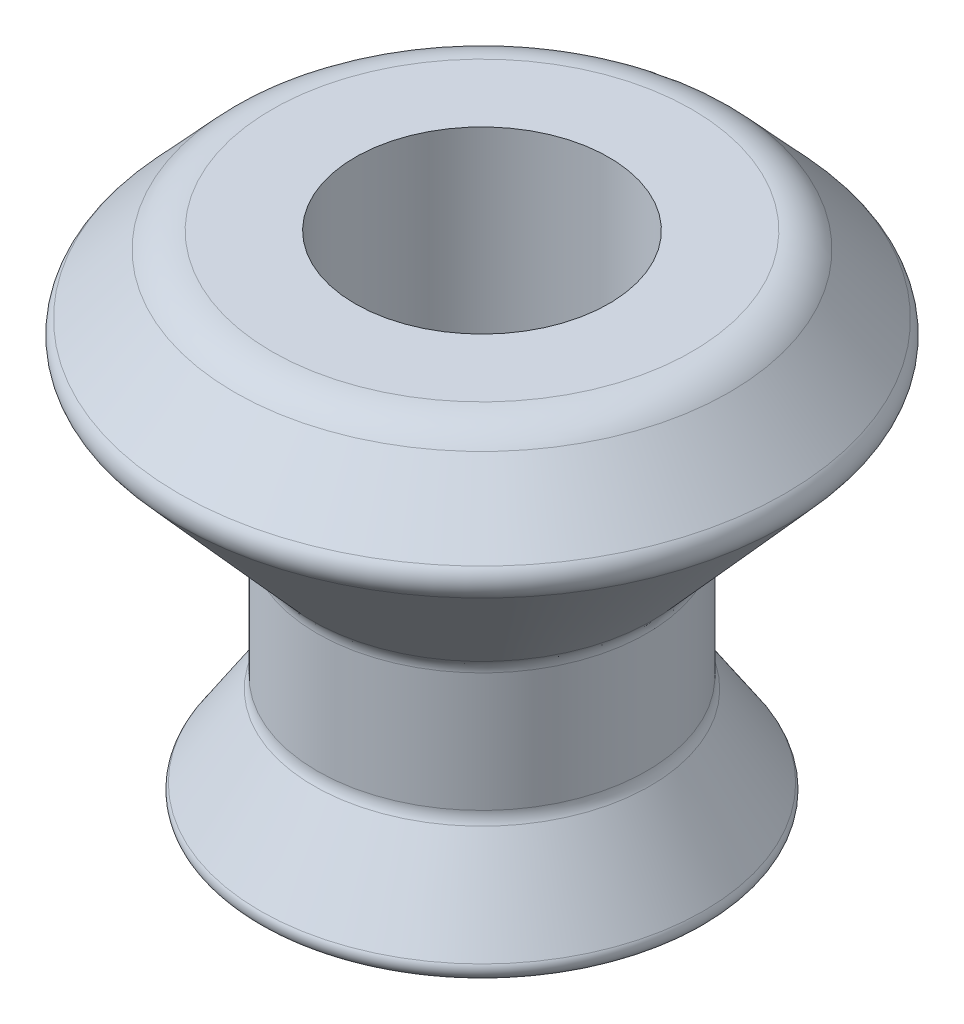
ISO-10303-21;
HEADER;
FILE_DESCRIPTION(('STEP AP214'),'2;1');
FILE_NAME('part.step','',(''),(''),'','','');
FILE_SCHEMA(('AUTOMOTIVE_DESIGN { 1 0 10303 214 1 1 1 1 }'));
ENDSEC;
DATA;
#1=APPLICATION_CONTEXT('core data for automotive mechanical design processes');
#2=APPLICATION_PROTOCOL_DEFINITION('international standard','automotive_design',2000,#1);
#3=PRODUCT_CONTEXT('',#1,'mechanical');
#4=PRODUCT('Part','Part','',(#3));
#5=PRODUCT_RELATED_PRODUCT_CATEGORY('part','',(#4));
#6=PRODUCT_DEFINITION_FORMATION('','',#4);
#7=PRODUCT_DEFINITION_CONTEXT('part definition',#1,'design');
#8=PRODUCT_DEFINITION('design','',#6,#7);
#9=PRODUCT_DEFINITION_SHAPE('','',#8);
#10=(LENGTH_UNIT() NAMED_UNIT(*) SI_UNIT(.MILLI.,.METRE.));
#11=(NAMED_UNIT(*) PLANE_ANGLE_UNIT() SI_UNIT($,.RADIAN.));
#12=(NAMED_UNIT(*) SI_UNIT($,.STERADIAN.) SOLID_ANGLE_UNIT());
#13=UNCERTAINTY_MEASURE_WITH_UNIT(LENGTH_MEASURE(1.E-05),#10,'distance_accuracy_value','');
#14=(GEOMETRIC_REPRESENTATION_CONTEXT(3) GLOBAL_UNCERTAINTY_ASSIGNED_CONTEXT((#13)) GLOBAL_UNIT_ASSIGNED_CONTEXT((#10,
#11,#12)) REPRESENTATION_CONTEXT('',''));
#15=CARTESIAN_POINT('',(0.,0.,0.));
#16=DIRECTION('',(0.,0.,1.));
#17=DIRECTION('',(1.,0.,0.));
#18=AXIS2_PLACEMENT_3D('',#15,#16,#17);
#19=CARTESIAN_POINT('',(0.,12.2682,0.));
#20=DIRECTION('',(0.,1.,0.));
#21=DIRECTION('',(0.,0.,1.));
#22=AXIS2_PLACEMENT_3D('',#19,#20,#21);
#23=PLANE('',#22);
#24=CARTESIAN_POINT('',(0.,12.2682,0.));
#25=DIRECTION('',(0.,1.,0.));
#26=DIRECTION('',(0.,0.,1.));
#27=AXIS2_PLACEMENT_3D('',#24,#25,#26);
#28=CIRCLE('',#27,3.1496);
#29=CARTESIAN_POINT('',(0.,12.2682,3.1496));
#30=VERTEX_POINT('',#29);
#31=EDGE_CURVE('E68',#30,#30,#28,.T.);
#32=ORIENTED_EDGE('',*,*,#31,.F.);
#33=EDGE_LOOP('',(#32));
#34=FACE_BOUND('',#33,.T.);
#35=CARTESIAN_POINT('',(0.,12.2682,0.));
#36=DIRECTION('',(0.,-1.,0.));
#37=DIRECTION('',(0.,0.,-1.));
#38=AXIS2_PLACEMENT_3D('',#35,#36,#37);
#39=CIRCLE('',#38,5.21100202038621);
#40=CARTESIAN_POINT('',(0.,12.2682,-5.21100202038621));
#41=VERTEX_POINT('',#40);
#42=EDGE_CURVE('E10',#41,#41,#39,.T.);
#43=ORIENTED_EDGE('',*,*,#42,.F.);
#44=EDGE_LOOP('',(#43));
#45=FACE_BOUND('',#44,.T.);
#46=ADVANCED_FACE('F30',(#34,#45),#23,.T.);
#47=CARTESIAN_POINT('',(0.,10.9982,0.));
#48=DIRECTION('',(0.,-1.,0.));
#49=DIRECTION('',(0.,0.,-1.));
#50=AXIS2_PLACEMENT_3D('',#47,#48,#49);
#51=TOROIDAL_SURFACE('',#50,5.21100202038622,1.27);
#52=ORIENTED_EDGE('',*,*,#42,.T.);
#53=EDGE_LOOP('',(#52));
#54=FACE_BOUND('',#53,.T.);
#55=CARTESIAN_POINT('',(0.,11.8611537655602,0.));
#56=DIRECTION('',(0.,-1.,0.));
#57=DIRECTION('',(0.,0.,-1.));
#58=AXIS2_PLACEMENT_3D('',#55,#56,#57);
#59=CIRCLE('',#58,6.14278031939598);
#60=CARTESIAN_POINT('',(0.,11.8611537655602,-6.14278031939598));
#61=VERTEX_POINT('',#60);
#62=EDGE_CURVE('E36',#61,#61,#59,.T.);
#63=ORIENTED_EDGE('',*,*,#62,.F.);
#64=EDGE_LOOP('',(#63));
#65=FACE_BOUND('',#64,.T.);
#66=ADVANCED_FACE('F95',(#54,#65),#51,.T.);
#67=CARTESIAN_POINT('',(0.,10.3721333400657,0.));
#68=DIRECTION('',(0.,-1.,0.));
#69=DIRECTION('',(0.,0.,-1.));
#70=AXIS2_PLACEMENT_3D('',#67,#68,#69);
#71=CONICAL_SURFACE('',#70,7.52181628164367,0.747068862148858);
#72=ORIENTED_EDGE('',*,*,#62,.T.);
#73=EDGE_LOOP('',(#72));
#74=FACE_BOUND('',#73,.T.);
#75=CARTESIAN_POINT('',(0.,10.3721333400657,0.));
#76=DIRECTION('',(0.,-1.,0.));
#77=DIRECTION('',(0.,0.,-1.));
#78=AXIS2_PLACEMENT_3D('',#75,#76,#77);
#79=CIRCLE('',#78,7.52181628164367);
#80=CARTESIAN_POINT('',(0.,10.3721333400657,-7.52181628164367));
#81=VERTEX_POINT('',#80);
#82=EDGE_CURVE('E40',#81,#81,#79,.T.);
#83=ORIENTED_EDGE('',*,*,#82,.F.);
#84=EDGE_LOOP('',(#83));
#85=FACE_BOUND('',#84,.T.);
#86=ADVANCED_FACE('F100',(#74,#85),#71,.T.);
#87=CARTESIAN_POINT('',(0.,10.0269518338417,0.));
#88=DIRECTION('',(0.,-1.,0.));
#89=DIRECTION('',(0.,0.,-1.));
#90=AXIS2_PLACEMENT_3D('',#87,#88,#89);
#91=TOROIDAL_SURFACE('',#90,7.14910496203977,0.508);
#92=ORIENTED_EDGE('',*,*,#82,.T.);
#93=EDGE_LOOP('',(#92));
#94=FACE_BOUND('',#93,.T.);
#95=CARTESIAN_POINT('',(0.,9.68838781554129,0.));
#96=DIRECTION('',(0.,-1.,0.));
#97=DIRECTION('',(0.,0.,-1.));
#98=AXIS2_PLACEMENT_3D('',#95,#96,#97);
#99=CIRCLE('',#98,7.52783759268085);
#100=CARTESIAN_POINT('',(0.,9.68838781554129,-7.52783759268085));
#101=VERTEX_POINT('',#100);
#102=EDGE_CURVE('E44',#101,#101,#99,.T.);
#103=ORIENTED_EDGE('',*,*,#102,.F.);
#104=EDGE_LOOP('',(#103));
#105=FACE_BOUND('',#104,.T.);
#106=ADVANCED_FACE('F136',(#94,#105),#91,.T.);
#107=CARTESIAN_POINT('',(0.,5.98660417589303,0.));
#108=DIRECTION('',(0.,1.,0.));
#109=DIRECTION('',(0.,0.,1.));
#110=AXIS2_PLACEMENT_3D('',#107,#108,#109);
#111=CONICAL_SURFACE('',#110,4.21866736935892,0.729456592163887);
#112=ORIENTED_EDGE('',*,*,#102,.T.);
#113=EDGE_LOOP('',(#112));
#114=FACE_BOUND('',#113,.T.);
#115=CARTESIAN_POINT('',(0.,5.98660417589303,0.));
#116=DIRECTION('',(0.,-1.,0.));
#117=DIRECTION('',(0.,0.,-1.));
#118=AXIS2_PLACEMENT_3D('',#115,#116,#117);
#119=CIRCLE('',#118,4.21866736935892);
#120=CARTESIAN_POINT('',(0.,5.98660417589303,-4.21866736935892));
#121=VERTEX_POINT('',#120);
#122=EDGE_CURVE('E49',#121,#121,#119,.T.);
#123=ORIENTED_EDGE('',*,*,#122,.F.);
#124=EDGE_LOOP('',(#123));
#125=FACE_BOUND('',#124,.T.);
#126=ADVANCED_FACE('F132',(#114,#125),#111,.T.);
#127=CARTESIAN_POINT('',(0.,5.64804015759267,0.));
#128=DIRECTION('',(0.,-1.,0.));
#129=DIRECTION('',(0.,0.,-1.));
#130=AXIS2_PLACEMENT_3D('',#127,#128,#129);
#131=TOROIDAL_SURFACE('',#130,4.5974,0.508);
#132=ORIENTED_EDGE('',*,*,#122,.T.);
#133=EDGE_LOOP('',(#132));
#134=FACE_BOUND('',#133,.T.);
#135=CARTESIAN_POINT('',(0.,5.64804015759267,0.));
#136=DIRECTION('',(0.,-1.,0.));
#137=DIRECTION('',(0.,0.,-1.));
#138=AXIS2_PLACEMENT_3D('',#135,#136,#137);
#139=CIRCLE('',#138,4.0894);
#140=CARTESIAN_POINT('',(0.,5.64804015759267,-4.0894));
#141=VERTEX_POINT('',#140);
#142=EDGE_CURVE('E52',#141,#141,#139,.T.);
#143=ORIENTED_EDGE('',*,*,#142,.F.);
#144=EDGE_LOOP('',(#143));
#145=FACE_BOUND('',#144,.T.);
#146=ADVANCED_FACE('F128',(#134,#145),#131,.F.);
#147=CARTESIAN_POINT('',(0.,0.,0.));
#148=DIRECTION('',(0.,-1.,0.));
#149=DIRECTION('',(0.,0.,-1.));
#150=AXIS2_PLACEMENT_3D('',#147,#148,#149);
#151=CYLINDRICAL_SURFACE('',#150,4.0894);
#152=ORIENTED_EDGE('',*,*,#142,.T.);
#153=EDGE_LOOP('',(#152));
#154=FACE_BOUND('',#153,.T.);
#155=CARTESIAN_POINT('',(0.,2.69252720324619,0.));
#156=DIRECTION('',(0.,-1.,0.));
#157=DIRECTION('',(0.,0.,-1.));
#158=AXIS2_PLACEMENT_3D('',#155,#156,#157);
#159=CIRCLE('',#158,4.0894);
#160=CARTESIAN_POINT('',(0.,2.69252720324619,-4.0894));
#161=VERTEX_POINT('',#160);
#162=EDGE_CURVE('E55',#161,#161,#159,.T.);
#163=ORIENTED_EDGE('',*,*,#162,.F.);
#164=EDGE_LOOP('',(#163));
#165=FACE_BOUND('',#164,.T.);
#166=ADVANCED_FACE('F124',(#154,#165),#151,.T.);
#167=CARTESIAN_POINT('',(0.,2.69252720324619,0.));
#168=DIRECTION('',(0.,-1.,0.));
#169=DIRECTION('',(0.,0.,-1.));
#170=AXIS2_PLACEMENT_3D('',#167,#168,#169);
#171=TOROIDAL_SURFACE('',#170,4.5974,0.508);
#172=ORIENTED_EDGE('',*,*,#162,.T.);
#173=EDGE_LOOP('',(#172));
#174=FACE_BOUND('',#173,.T.);
#175=CARTESIAN_POINT('',(0.,2.41269936141417,0.));
#176=DIRECTION('',(0.,-1.,0.));
#177=DIRECTION('',(0.,0.,-1.));
#178=AXIS2_PLACEMENT_3D('',#175,#176,#177);
#179=CIRCLE('',#178,4.17341842146664);
#180=CARTESIAN_POINT('',(0.,2.41269936141417,-4.17341842146664));
#181=VERTEX_POINT('',#180);
#182=EDGE_CURVE('E58',#181,#181,#179,.T.);
#183=ORIENTED_EDGE('',*,*,#182,.F.);
#184=EDGE_LOOP('',(#183));
#185=FACE_BOUND('',#184,.T.);
#186=ADVANCED_FACE('F120',(#174,#185),#171,.F.);
#187=CARTESIAN_POINT('',(0.,0.393913920916011,0.));
#188=DIRECTION('',(0.,-1.,0.));
#189=DIRECTION('',(0.,0.,-1.));
#190=AXIS2_PLACEMENT_3D('',#187,#188,#189);
#191=CONICAL_SURFACE('',#190,5.50581681219543,0.583373006993857);
#192=ORIENTED_EDGE('',*,*,#182,.T.);
#193=EDGE_LOOP('',(#192));
#194=FACE_BOUND('',#193,.T.);
#195=CARTESIAN_POINT('',(0.,0.393913920916011,0.));
#196=DIRECTION('',(0.,-1.,0.));
#197=DIRECTION('',(0.,0.,-1.));
#198=AXIS2_PLACEMENT_3D('',#195,#196,#197);
#199=CIRCLE('',#198,5.50581681219543);
#200=CARTESIAN_POINT('',(0.,0.393913920916011,-5.50581681219543));
#201=VERTEX_POINT('',#200);
#202=EDGE_CURVE('E61',#201,#201,#199,.T.);
#203=ORIENTED_EDGE('',*,*,#202,.F.);
#204=EDGE_LOOP('',(#203));
#205=FACE_BOUND('',#204,.T.);
#206=ADVANCED_FACE('F116',(#194,#205),#191,.T.);
#207=CARTESIAN_POINT('',(0.,0.254,0.));
#208=DIRECTION('',(0.,-1.,0.));
#209=DIRECTION('',(0.,0.,-1.));
#210=AXIS2_PLACEMENT_3D('',#207,#208,#209);
#211=TOROIDAL_SURFACE('',#210,5.29382602292876,0.254);
#212=ORIENTED_EDGE('',*,*,#202,.T.);
#213=EDGE_LOOP('',(#212));
#214=FACE_BOUND('',#213,.T.);
#215=CARTESIAN_POINT('',(0.,0.,0.));
#216=DIRECTION('',(0.,-1.,0.));
#217=DIRECTION('',(0.,0.,-1.));
#218=AXIS2_PLACEMENT_3D('',#215,#216,#217);
#219=CIRCLE('',#218,5.29382602292875);
#220=CARTESIAN_POINT('',(0.,0.,-5.29382602292875));
#221=VERTEX_POINT('',#220);
#222=EDGE_CURVE('E64',#221,#221,#219,.T.);
#223=ORIENTED_EDGE('',*,*,#222,.F.);
#224=EDGE_LOOP('',(#223));
#225=FACE_BOUND('',#224,.T.);
#226=ADVANCED_FACE('F110',(#214,#225),#211,.T.);
#227=CARTESIAN_POINT('',(0.,0.,0.));
#228=DIRECTION('',(0.,-1.,0.));
#229=DIRECTION('',(0.,0.,-1.));
#230=AXIS2_PLACEMENT_3D('',#227,#228,#229);
#231=PLANE('',#230);
#232=CARTESIAN_POINT('',(0.,0.,0.));
#233=DIRECTION('',(0.,1.,0.));
#234=DIRECTION('',(0.,0.,1.));
#235=AXIS2_PLACEMENT_3D('',#232,#233,#234);
#236=CIRCLE('',#235,2.0066);
#237=CARTESIAN_POINT('',(0.,0.,2.0066));
#238=VERTEX_POINT('',#237);
#239=EDGE_CURVE('E76',#238,#238,#236,.T.);
#240=ORIENTED_EDGE('',*,*,#239,.T.);
#241=EDGE_LOOP('',(#240));
#242=FACE_BOUND('',#241,.T.);
#243=ORIENTED_EDGE('',*,*,#222,.T.);
#244=EDGE_LOOP('',(#243));
#245=FACE_BOUND('',#244,.T.);
#246=ADVANCED_FACE('F80',(#242,#245),#231,.T.);
#247=CARTESIAN_POINT('',(0.,2.6162,0.));
#248=DIRECTION('',(0.,1.,0.));
#249=DIRECTION('',(0.,0.,1.));
#250=AXIS2_PLACEMENT_3D('',#247,#248,#249);
#251=CYLINDRICAL_SURFACE('',#250,3.1496);
#252=CARTESIAN_POINT('',(0.,2.6162,0.));
#253=DIRECTION('',(0.,1.,0.));
#254=DIRECTION('',(0.,0.,1.));
#255=AXIS2_PLACEMENT_3D('',#252,#253,#254);
#256=CIRCLE('',#255,3.1496);
#257=CARTESIAN_POINT('',(0.,2.6162,3.1496));
#258=VERTEX_POINT('',#257);
#259=EDGE_CURVE('E67',#258,#258,#256,.T.);
#260=ORIENTED_EDGE('',*,*,#259,.F.);
#261=EDGE_LOOP('',(#260));
#262=FACE_BOUND('',#261,.T.);
#263=ORIENTED_EDGE('',*,*,#31,.T.);
#264=EDGE_LOOP('',(#263));
#265=FACE_BOUND('',#264,.T.);
#266=ADVANCED_FACE('F91',(#262,#265),#251,.F.);
#267=CARTESIAN_POINT('',(0.,2.6162,0.));
#268=DIRECTION('',(0.,1.,0.));
#269=DIRECTION('',(0.,0.,1.));
#270=AXIS2_PLACEMENT_3D('',#267,#268,#269);
#271=PLANE('',#270);
#272=CARTESIAN_POINT('',(0.,2.6162,0.));
#273=DIRECTION('',(0.,1.,0.));
#274=DIRECTION('',(0.,0.,1.));
#275=AXIS2_PLACEMENT_3D('',#272,#273,#274);
#276=CIRCLE('',#275,2.0066);
#277=CARTESIAN_POINT('',(0.,2.6162,2.0066));
#278=VERTEX_POINT('',#277);
#279=EDGE_CURVE('E71',#278,#278,#276,.T.);
#280=ORIENTED_EDGE('',*,*,#279,.F.);
#281=EDGE_LOOP('',(#280));
#282=FACE_BOUND('',#281,.T.);
#283=ORIENTED_EDGE('',*,*,#259,.T.);
#284=EDGE_LOOP('',(#283));
#285=FACE_BOUND('',#284,.T.);
#286=ADVANCED_FACE('F85',(#282,#285),#271,.T.);
#287=CARTESIAN_POINT('',(0.,0.,0.));
#288=DIRECTION('',(0.,1.,0.));
#289=DIRECTION('',(0.,0.,1.));
#290=AXIS2_PLACEMENT_3D('',#287,#288,#289);
#291=CYLINDRICAL_SURFACE('',#290,2.0066);
#292=ORIENTED_EDGE('',*,*,#279,.T.);
#293=EDGE_LOOP('',(#292));
#294=FACE_BOUND('',#293,.T.);
#295=ORIENTED_EDGE('',*,*,#239,.F.);
#296=EDGE_LOOP('',(#295));
#297=FACE_BOUND('',#296,.T.);
#298=ADVANCED_FACE('F83',(#294,#297),#291,.F.);
#299=CLOSED_SHELL('',(#46,#66,#86,#106,#126,#146,#166,#186,#206,#226,#246,#266,#286,#298));
#300=MANIFOLD_SOLID_BREP('B2',#299);
#301=ADVANCED_BREP_SHAPE_REPRESENTATION('',(#18,#300),#14);
#302=SHAPE_DEFINITION_REPRESENTATION(#9,#301);
ENDSEC;
END-ISO-10303-21;
